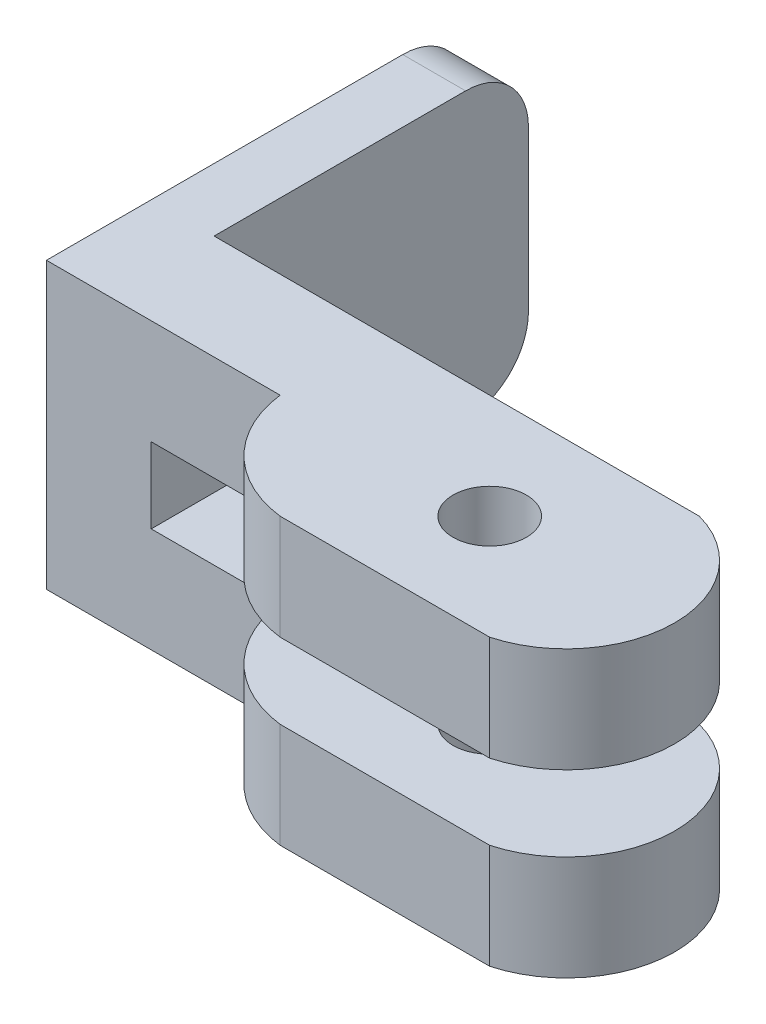
ISO-10303-21;
HEADER;
FILE_DESCRIPTION(('STEP AP214'),'2;1');
FILE_NAME('part.step','',(''),(''),'','','');
FILE_SCHEMA(('AUTOMOTIVE_DESIGN { 1 0 10303 214 1 1 1 1 }'));
ENDSEC;
DATA;
#1=APPLICATION_CONTEXT('core data for automotive mechanical design processes');
#2=APPLICATION_PROTOCOL_DEFINITION('international standard','automotive_design',2000,#1);
#3=PRODUCT_CONTEXT('',#1,'mechanical');
#4=PRODUCT('Part','Part','',(#3));
#5=PRODUCT_RELATED_PRODUCT_CATEGORY('part','',(#4));
#6=PRODUCT_DEFINITION_FORMATION('','',#4);
#7=PRODUCT_DEFINITION_CONTEXT('part definition',#1,'design');
#8=PRODUCT_DEFINITION('design','',#6,#7);
#9=PRODUCT_DEFINITION_SHAPE('','',#8);
#10=(LENGTH_UNIT() NAMED_UNIT(*) SI_UNIT(.MILLI.,.METRE.));
#11=(NAMED_UNIT(*) PLANE_ANGLE_UNIT() SI_UNIT($,.RADIAN.));
#12=(NAMED_UNIT(*) SI_UNIT($,.STERADIAN.) SOLID_ANGLE_UNIT());
#13=UNCERTAINTY_MEASURE_WITH_UNIT(LENGTH_MEASURE(1.E-05),#10,'distance_accuracy_value','');
#14=(GEOMETRIC_REPRESENTATION_CONTEXT(3) GLOBAL_UNCERTAINTY_ASSIGNED_CONTEXT((#13)) GLOBAL_UNIT_ASSIGNED_CONTEXT((#10,
#11,#12)) REPRESENTATION_CONTEXT('',''));
#15=CARTESIAN_POINT('',(0.,0.,0.));
#16=DIRECTION('',(0.,0.,1.));
#17=DIRECTION('',(1.,0.,0.));
#18=AXIS2_PLACEMENT_3D('',#15,#16,#17);
#19=CARTESIAN_POINT('',(0.,0.,0.));
#20=DIRECTION('',(0.,0.,1.));
#21=DIRECTION('',(1.,0.,0.));
#22=AXIS2_PLACEMENT_3D('',#19,#20,#21);
#23=PLANE('',#22);
#24=DIRECTION('',(0.,-1.,0.));
#25=VECTOR('',#24,1.);
#26=CARTESIAN_POINT('',(63.,0.,0.));
#27=LINE('',#26,#25);
#28=CARTESIAN_POINT('',(62.9999999999999,6.80000000000001,0.));
#29=VERTEX_POINT('',#28);
#30=CARTESIAN_POINT('',(63.,-6.79999999999999,0.));
#31=VERTEX_POINT('',#30);
#32=EDGE_CURVE('E172',#29,#31,#27,.T.);
#33=ORIENTED_EDGE('',*,*,#32,.F.);
#34=DIRECTION('',(-1.,0.,0.));
#35=VECTOR('',#34,1.);
#36=CARTESIAN_POINT('',(-90.,6.79999999999999,0.));
#37=LINE('',#36,#35);
#38=CARTESIAN_POINT('',(86.15,6.8,0.));
#39=VERTEX_POINT('',#38);
#40=EDGE_CURVE('E233',#39,#29,#37,.T.);
#41=ORIENTED_EDGE('',*,*,#40,.F.);
#42=DIRECTION('',(0.,1.,0.));
#43=VECTOR('',#42,1.);
#44=CARTESIAN_POINT('',(86.15,-6.80000000000001,0.));
#45=LINE('',#44,#43);
#46=CARTESIAN_POINT('',(86.15,1.80000000000001,0.));
#47=VERTEX_POINT('',#46);
#48=EDGE_CURVE('E198',#47,#39,#45,.T.);
#49=ORIENTED_EDGE('',*,*,#48,.F.);
#50=DIRECTION('',(1.,0.,0.));
#51=VECTOR('',#50,1.);
#52=CARTESIAN_POINT('',(90.,1.80000000000001,0.));
#53=LINE('',#52,#51);
#54=CARTESIAN_POINT('',(65.,1.80000000000001,0.));
#55=VERTEX_POINT('',#54);
#56=EDGE_CURVE('E249',#55,#47,#53,.T.);
#57=ORIENTED_EDGE('',*,*,#56,.F.);
#58=DIRECTION('',(0.,1.,0.));
#59=VECTOR('',#58,1.);
#60=CARTESIAN_POINT('',(65.,-1.79999999999999,0.));
#61=LINE('',#60,#59);
#62=CARTESIAN_POINT('',(65.,-1.79999999999999,0.));
#63=VERTEX_POINT('',#62);
#64=EDGE_CURVE('E246',#63,#55,#61,.T.);
#65=ORIENTED_EDGE('',*,*,#64,.F.);
#66=DIRECTION('',(-1.,0.,0.));
#67=VECTOR('',#66,1.);
#68=CARTESIAN_POINT('',(90.,-1.79999999999999,0.));
#69=LINE('',#68,#67);
#70=CARTESIAN_POINT('',(86.15,-1.79999999999999,0.));
#71=VERTEX_POINT('',#70);
#72=EDGE_CURVE('E244',#71,#63,#69,.T.);
#73=ORIENTED_EDGE('',*,*,#72,.F.);
#74=CARTESIAN_POINT('',(86.15,-6.80000000000001,0.));
#75=VERTEX_POINT('',#74);
#76=EDGE_CURVE('E205',#75,#71,#45,.T.);
#77=ORIENTED_EDGE('',*,*,#76,.F.);
#78=DIRECTION('',(1.,0.,0.));
#79=VECTOR('',#78,1.);
#80=CARTESIAN_POINT('',(-90.,-6.80000000000001,0.));
#81=LINE('',#80,#79);
#82=EDGE_CURVE('E228',#31,#75,#81,.T.);
#83=ORIENTED_EDGE('',*,*,#82,.F.);
#84=EDGE_LOOP('',(#33,#41,#49,#57,#65,#73,#77,#83));
#85=FACE_BOUND('',#84,.T.);
#86=ADVANCED_FACE('F37',(#85),#23,.F.);
#87=CARTESIAN_POINT('',(-90.,-6.80000000000001,10.));
#88=DIRECTION('',(0.,1.,0.));
#89=DIRECTION('',(-1.,0.,0.));
#90=AXIS2_PLACEMENT_3D('',#87,#88,#89);
#91=PLANE('',#90);
#92=DIRECTION('',(1.,0.,0.));
#93=VECTOR('',#92,1.);
#94=CARTESIAN_POINT('',(0.,-6.80000000000001,5.));
#95=LINE('',#94,#93);
#96=CARTESIAN_POINT('',(60.,-6.79999999999999,5.00000000000001));
#97=VERTEX_POINT('',#96);
#98=CARTESIAN_POINT('',(71.15,-6.80000000000001,5.));
#99=VERTEX_POINT('',#98);
#100=EDGE_CURVE('E168',#97,#99,#95,.T.);
#101=ORIENTED_EDGE('',*,*,#100,.F.);
#102=DIRECTION('',(0.,0.,1.));
#103=VECTOR('',#102,1.);
#104=CARTESIAN_POINT('',(60.,-6.79999999999999,-15.));
#105=LINE('',#104,#103);
#106=CARTESIAN_POINT('',(60.,-6.79999999999999,-12.));
#107=VERTEX_POINT('',#106);
#108=EDGE_CURVE('E152',#107,#97,#105,.T.);
#109=ORIENTED_EDGE('',*,*,#108,.F.);
#110=DIRECTION('',(-1.,0.,0.));
#111=VECTOR('',#110,1.);
#112=CARTESIAN_POINT('',(63.,-6.79999999999999,-12.));
#113=LINE('',#112,#111);
#114=CARTESIAN_POINT('',(63.,-6.79999999999999,-12.));
#115=VERTEX_POINT('',#114);
#116=EDGE_CURVE('E268',#107,#115,#113,.F.);
#117=ORIENTED_EDGE('',*,*,#116,.T.);
#118=DIRECTION('',(0.,0.,1.));
#119=VECTOR('',#118,1.);
#120=CARTESIAN_POINT('',(63.,-6.79999999999999,-15.));
#121=LINE('',#120,#119);
#122=EDGE_CURVE('E162',#115,#31,#121,.T.);
#123=ORIENTED_EDGE('',*,*,#122,.T.);
#124=ORIENTED_EDGE('',*,*,#82,.T.);
#125=CARTESIAN_POINT('',(84.7916666666666,-6.80000000000001,5.));
#126=DIRECTION('',(0.,1.,0.));
#127=DIRECTION('',(0.,0.,1.));
#128=AXIS2_PLACEMENT_3D('',#125,#126,#127);
#129=CIRCLE('',#128,5.18122277502567);
#130=CARTESIAN_POINT('',(86.15,-6.80000000000001,10.));
#131=VERTEX_POINT('',#130);
#132=EDGE_CURVE('E195',#75,#131,#129,.F.);
#133=ORIENTED_EDGE('',*,*,#132,.T.);
#134=DIRECTION('',(1.,0.,0.));
#135=VECTOR('',#134,1.);
#136=CARTESIAN_POINT('',(-90.,-6.80000000000001,10.));
#137=LINE('',#136,#135);
#138=CARTESIAN_POINT('',(76.15,-6.80000000000001,10.));
#139=VERTEX_POINT('',#138);
#140=EDGE_CURVE('E229',#139,#131,#137,.T.);
#141=ORIENTED_EDGE('',*,*,#140,.F.);
#142=CARTESIAN_POINT('',(76.8382783421429,-6.80000000000001,4.3117216578571));
#143=DIRECTION('',(0.,1.,0.));
#144=DIRECTION('',(0.,0.,1.));
#145=AXIS2_PLACEMENT_3D('',#142,#143,#144);
#146=CIRCLE('',#145,5.72976767190041);
#147=EDGE_CURVE('E178',#139,#99,#146,.F.);
#148=ORIENTED_EDGE('',*,*,#147,.T.);
#149=EDGE_LOOP('',(#101,#109,#117,#123,#124,#133,#141,#148));
#150=FACE_BOUND('',#149,.T.);
#151=CARTESIAN_POINT('',(81.1500000000001,-6.80000000000001,5.));
#152=DIRECTION('',(0.,1.,0.));
#153=DIRECTION('',(0.,0.,1.));
#154=AXIS2_PLACEMENT_3D('',#151,#152,#153);
#155=CIRCLE('',#154,1.75);
#156=CARTESIAN_POINT('',(81.1500000000001,-6.80000000000001,6.75));
#157=VERTEX_POINT('',#156);
#158=EDGE_CURVE('E201',#157,#157,#155,.F.);
#159=ORIENTED_EDGE('',*,*,#158,.F.);
#160=EDGE_LOOP('',(#159));
#161=FACE_BOUND('',#160,.T.);
#162=ADVANCED_FACE('F175',(#150,#161),#91,.F.);
#163=CARTESIAN_POINT('',(-90.,6.79999999999999,10.));
#164=DIRECTION('',(0.,-1.,0.));
#165=DIRECTION('',(1.,0.,0.));
#166=AXIS2_PLACEMENT_3D('',#163,#164,#165);
#167=PLANE('',#166);
#168=DIRECTION('',(0.,0.,1.));
#169=VECTOR('',#168,1.);
#170=CARTESIAN_POINT('',(60.,6.80000000000001,-15.));
#171=LINE('',#170,#169);
#172=CARTESIAN_POINT('',(60.,6.80000000000001,-12.));
#173=VERTEX_POINT('',#172);
#174=CARTESIAN_POINT('',(60.,6.80000000000003,5.00000000000001));
#175=VERTEX_POINT('',#174);
#176=EDGE_CURVE('E212',#173,#175,#171,.T.);
#177=ORIENTED_EDGE('',*,*,#176,.T.);
#178=DIRECTION('',(1.,0.,0.));
#179=VECTOR('',#178,1.);
#180=CARTESIAN_POINT('',(0.,6.8,5.));
#181=LINE('',#180,#179);
#182=CARTESIAN_POINT('',(71.15,6.8,5.));
#183=VERTEX_POINT('',#182);
#184=EDGE_CURVE('E171',#175,#183,#181,.T.);
#185=ORIENTED_EDGE('',*,*,#184,.T.);
#186=CARTESIAN_POINT('',(76.8382783421429,6.8,4.3117216578571));
#187=DIRECTION('',(0.,1.,0.));
#188=DIRECTION('',(0.,0.,1.));
#189=AXIS2_PLACEMENT_3D('',#186,#187,#188);
#190=CIRCLE('',#189,5.72976767190041);
#191=CARTESIAN_POINT('',(76.15,6.8,10.));
#192=VERTEX_POINT('',#191);
#193=EDGE_CURVE('E186',#192,#183,#190,.F.);
#194=ORIENTED_EDGE('',*,*,#193,.F.);
#195=DIRECTION('',(-1.,0.,0.));
#196=VECTOR('',#195,1.);
#197=CARTESIAN_POINT('',(-90.,6.79999999999999,10.));
#198=LINE('',#197,#196);
#199=CARTESIAN_POINT('',(86.15,6.8,10.));
#200=VERTEX_POINT('',#199);
#201=EDGE_CURVE('E239',#200,#192,#198,.T.);
#202=ORIENTED_EDGE('',*,*,#201,.F.);
#203=CARTESIAN_POINT('',(84.7916666666666,6.8,5.));
#204=DIRECTION('',(0.,1.,0.));
#205=DIRECTION('',(0.,0.,1.));
#206=AXIS2_PLACEMENT_3D('',#203,#204,#205);
#207=CIRCLE('',#206,5.18122277502567);
#208=EDGE_CURVE('E199',#39,#200,#207,.F.);
#209=ORIENTED_EDGE('',*,*,#208,.F.);
#210=ORIENTED_EDGE('',*,*,#40,.T.);
#211=DIRECTION('',(0.,0.,1.));
#212=VECTOR('',#211,1.);
#213=CARTESIAN_POINT('',(63.,6.80000000000001,-15.));
#214=LINE('',#213,#212);
#215=CARTESIAN_POINT('',(63.,6.80000000000001,-12.));
#216=VERTEX_POINT('',#215);
#217=EDGE_CURVE('E279',#216,#29,#214,.T.);
#218=ORIENTED_EDGE('',*,*,#217,.F.);
#219=DIRECTION('',(1.,0.,0.));
#220=VECTOR('',#219,1.);
#221=CARTESIAN_POINT('',(60.,6.80000000000001,-12.));
#222=LINE('',#221,#220);
#223=EDGE_CURVE('E266',#216,#173,#222,.F.);
#224=ORIENTED_EDGE('',*,*,#223,.T.);
#225=EDGE_LOOP('',(#177,#185,#194,#202,#209,#210,#218,#224));
#226=FACE_BOUND('',#225,.T.);
#227=CARTESIAN_POINT('',(81.1500000000001,6.8,5.));
#228=DIRECTION('',(0.,1.,0.));
#229=DIRECTION('',(0.,0.,1.));
#230=AXIS2_PLACEMENT_3D('',#227,#228,#229);
#231=CIRCLE('',#230,1.75);
#232=CARTESIAN_POINT('',(81.1500000000001,6.8,6.75));
#233=VERTEX_POINT('',#232);
#234=EDGE_CURVE('E209',#233,#233,#231,.F.);
#235=ORIENTED_EDGE('',*,*,#234,.T.);
#236=EDGE_LOOP('',(#235));
#237=FACE_BOUND('',#236,.T.);
#238=ADVANCED_FACE('F282',(#226,#237),#167,.F.);
#239=CARTESIAN_POINT('',(0.,0.,10.));
#240=DIRECTION('',(0.,0.,1.));
#241=DIRECTION('',(1.,0.,0.));
#242=AXIS2_PLACEMENT_3D('',#239,#240,#241);
#243=PLANE('',#242);
#244=DIRECTION('',(0.,1.,0.));
#245=VECTOR('',#244,1.);
#246=CARTESIAN_POINT('',(76.15,-6.80000000000001,10.));
#247=LINE('',#246,#245);
#248=CARTESIAN_POINT('',(76.15,-1.79999999999999,10.));
#249=VERTEX_POINT('',#248);
#250=EDGE_CURVE('E181',#139,#249,#247,.T.);
#251=ORIENTED_EDGE('',*,*,#250,.F.);
#252=ORIENTED_EDGE('',*,*,#140,.T.);
#253=DIRECTION('',(0.,1.,0.));
#254=VECTOR('',#253,1.);
#255=CARTESIAN_POINT('',(86.15,-6.80000000000001,10.));
#256=LINE('',#255,#254);
#257=CARTESIAN_POINT('',(86.15,-1.79999999999999,10.));
#258=VERTEX_POINT('',#257);
#259=EDGE_CURVE('E189',#131,#258,#256,.T.);
#260=ORIENTED_EDGE('',*,*,#259,.T.);
#261=DIRECTION('',(-1.,0.,0.));
#262=VECTOR('',#261,1.);
#263=CARTESIAN_POINT('',(90.,-1.79999999999999,10.));
#264=LINE('',#263,#262);
#265=EDGE_CURVE('E232',#258,#249,#264,.T.);
#266=ORIENTED_EDGE('',*,*,#265,.T.);
#267=EDGE_LOOP('',(#251,#252,#260,#266));
#268=FACE_BOUND('',#267,.T.);
#269=ADVANCED_FACE('F336',(#268),#243,.T.);
#270=CARTESIAN_POINT('',(90.,-1.79999999999999,10.));
#271=DIRECTION('',(0.,-1.,0.));
#272=DIRECTION('',(1.,0.,0.));
#273=AXIS2_PLACEMENT_3D('',#270,#271,#272);
#274=PLANE('',#273);
#275=DIRECTION('',(-1.,0.,0.));
#276=VECTOR('',#275,1.);
#277=CARTESIAN_POINT('',(90.,-1.79999999999999,5.));
#278=LINE('',#277,#276);
#279=CARTESIAN_POINT('',(71.15,-1.79999999999999,5.));
#280=VERTEX_POINT('',#279);
#281=CARTESIAN_POINT('',(65.,-1.79999999999999,5.));
#282=VERTEX_POINT('',#281);
#283=EDGE_CURVE('E216',#280,#282,#278,.T.);
#284=ORIENTED_EDGE('',*,*,#283,.F.);
#285=CARTESIAN_POINT('',(76.8382783421429,-1.79999999999999,4.3117216578571));
#286=DIRECTION('',(0.,-1.,0.));
#287=DIRECTION('',(1.,0.,0.));
#288=AXIS2_PLACEMENT_3D('',#285,#286,#287);
#289=CIRCLE('',#288,5.72976767190041);
#290=EDGE_CURVE('E225',#280,#249,#289,.F.);
#291=ORIENTED_EDGE('',*,*,#290,.T.);
#292=ORIENTED_EDGE('',*,*,#265,.F.);
#293=CARTESIAN_POINT('',(84.7916666666666,-1.79999999999999,5.));
#294=DIRECTION('',(0.,-1.,0.));
#295=DIRECTION('',(1.,0.,0.));
#296=AXIS2_PLACEMENT_3D('',#293,#294,#295);
#297=CIRCLE('',#296,5.18122277502567);
#298=EDGE_CURVE('E222',#258,#71,#297,.F.);
#299=ORIENTED_EDGE('',*,*,#298,.T.);
#300=ORIENTED_EDGE('',*,*,#72,.T.);
#301=DIRECTION('',(0.,0.,-1.));
#302=VECTOR('',#301,1.);
#303=CARTESIAN_POINT('',(65.,-1.79999999999999,10.));
#304=LINE('',#303,#302);
#305=EDGE_CURVE('E255',#282,#63,#304,.T.);
#306=ORIENTED_EDGE('',*,*,#305,.F.);
#307=EDGE_LOOP('',(#284,#291,#292,#299,#300,#306));
#308=FACE_BOUND('',#307,.T.);
#309=CARTESIAN_POINT('',(81.1500000000001,-1.79999999999999,5.));
#310=DIRECTION('',(0.,-1.,0.));
#311=DIRECTION('',(1.,0.,0.));
#312=AXIS2_PLACEMENT_3D('',#309,#310,#311);
#313=CIRCLE('',#312,1.75);
#314=CARTESIAN_POINT('',(82.9000000000001,-1.79999999999999,5.));
#315=VERTEX_POINT('',#314);
#316=EDGE_CURVE('E219',#315,#315,#313,.F.);
#317=ORIENTED_EDGE('',*,*,#316,.F.);
#318=EDGE_LOOP('',(#317));
#319=FACE_BOUND('',#318,.T.);
#320=ADVANCED_FACE('F342',(#308,#319),#274,.F.);
#321=CARTESIAN_POINT('',(65.,-1.79999999999999,10.));
#322=DIRECTION('',(-1.,0.,0.));
#323=DIRECTION('',(0.,0.,1.));
#324=AXIS2_PLACEMENT_3D('',#321,#322,#323);
#325=PLANE('',#324);
#326=DIRECTION('',(0.,1.,0.));
#327=VECTOR('',#326,1.);
#328=CARTESIAN_POINT('',(65.,-1.79999999999999,5.));
#329=LINE('',#328,#327);
#330=CARTESIAN_POINT('',(65.,1.80000000000001,5.));
#331=VERTEX_POINT('',#330);
#332=EDGE_CURVE('E214',#282,#331,#329,.T.);
#333=ORIENTED_EDGE('',*,*,#332,.F.);
#334=ORIENTED_EDGE('',*,*,#305,.T.);
#335=ORIENTED_EDGE('',*,*,#64,.T.);
#336=DIRECTION('',(0.,0.,-1.));
#337=VECTOR('',#336,1.);
#338=CARTESIAN_POINT('',(65.,1.80000000000001,10.));
#339=LINE('',#338,#337);
#340=EDGE_CURVE('E242',#331,#55,#339,.T.);
#341=ORIENTED_EDGE('',*,*,#340,.F.);
#342=EDGE_LOOP('',(#333,#334,#335,#341));
#343=FACE_BOUND('',#342,.T.);
#344=ADVANCED_FACE('F339',(#343),#325,.F.);
#345=CARTESIAN_POINT('',(90.,1.80000000000001,10.));
#346=DIRECTION('',(0.,1.,0.));
#347=DIRECTION('',(-1.,0.,0.));
#348=AXIS2_PLACEMENT_3D('',#345,#346,#347);
#349=PLANE('',#348);
#350=DIRECTION('',(1.,0.,0.));
#351=VECTOR('',#350,1.);
#352=CARTESIAN_POINT('',(90.,1.80000000000001,5.));
#353=LINE('',#352,#351);
#354=CARTESIAN_POINT('',(71.15,1.80000000000001,5.));
#355=VERTEX_POINT('',#354);
#356=EDGE_CURVE('E192',#331,#355,#353,.T.);
#357=ORIENTED_EDGE('',*,*,#356,.F.);
#358=ORIENTED_EDGE('',*,*,#340,.T.);
#359=ORIENTED_EDGE('',*,*,#56,.T.);
#360=CARTESIAN_POINT('',(84.7916666666666,1.80000000000001,5.));
#361=DIRECTION('',(0.,1.,0.));
#362=DIRECTION('',(-1.,0.,0.));
#363=AXIS2_PLACEMENT_3D('',#360,#361,#362);
#364=CIRCLE('',#363,5.18122277502567);
#365=CARTESIAN_POINT('',(86.15,1.80000000000001,10.));
#366=VERTEX_POINT('',#365);
#367=EDGE_CURVE('E258',#47,#366,#364,.F.);
#368=ORIENTED_EDGE('',*,*,#367,.T.);
#369=DIRECTION('',(1.,0.,0.));
#370=VECTOR('',#369,1.);
#371=CARTESIAN_POINT('',(90.,1.80000000000001,10.));
#372=LINE('',#371,#370);
#373=CARTESIAN_POINT('',(76.15,1.80000000000001,10.));
#374=VERTEX_POINT('',#373);
#375=EDGE_CURVE('E236',#374,#366,#372,.T.);
#376=ORIENTED_EDGE('',*,*,#375,.F.);
#377=CARTESIAN_POINT('',(76.8382783421429,1.80000000000001,4.3117216578571));
#378=DIRECTION('',(0.,1.,0.));
#379=DIRECTION('',(-1.,0.,0.));
#380=AXIS2_PLACEMENT_3D('',#377,#378,#379);
#381=CIRCLE('',#380,5.72976767190041);
#382=EDGE_CURVE('E263',#374,#355,#381,.F.);
#383=ORIENTED_EDGE('',*,*,#382,.T.);
#384=EDGE_LOOP('',(#357,#358,#359,#368,#376,#383));
#385=FACE_BOUND('',#384,.T.);
#386=CARTESIAN_POINT('',(81.1500000000001,1.80000000000001,5.));
#387=DIRECTION('',(0.,1.,0.));
#388=DIRECTION('',(-1.,0.,0.));
#389=AXIS2_PLACEMENT_3D('',#386,#387,#388);
#390=CIRCLE('',#389,1.75);
#391=CARTESIAN_POINT('',(79.4,1.80000000000001,5.));
#392=VERTEX_POINT('',#391);
#393=EDGE_CURVE('E218',#392,#392,#390,.F.);
#394=ORIENTED_EDGE('',*,*,#393,.F.);
#395=EDGE_LOOP('',(#394));
#396=FACE_BOUND('',#395,.T.);
#397=ADVANCED_FACE('F310',(#385,#396),#349,.F.);
#398=EDGE_CURVE('E179',#374,#192,#247,.T.);
#399=ORIENTED_EDGE('',*,*,#398,.F.);
#400=ORIENTED_EDGE('',*,*,#375,.T.);
#401=EDGE_CURVE('E204',#366,#200,#256,.T.);
#402=ORIENTED_EDGE('',*,*,#401,.T.);
#403=ORIENTED_EDGE('',*,*,#201,.T.);
#404=EDGE_LOOP('',(#399,#400,#402,#403));
#405=FACE_BOUND('',#404,.T.);
#406=ADVANCED_FACE('F307',(#405),#243,.T.);
#407=CARTESIAN_POINT('',(76.8382783421429,-6.80000000000001,4.3117216578571));
#408=DIRECTION('',(0.,1.,0.));
#409=DIRECTION('',(0.,0.,1.));
#410=AXIS2_PLACEMENT_3D('',#407,#408,#409);
#411=CYLINDRICAL_SURFACE('',#410,5.72976767190041);
#412=DIRECTION('',(0.,1.,0.));
#413=VECTOR('',#412,1.);
#414=CARTESIAN_POINT('',(71.15,-6.80000000000001,5.));
#415=LINE('',#414,#413);
#416=EDGE_CURVE('E191',#99,#280,#415,.T.);
#417=ORIENTED_EDGE('',*,*,#416,.F.);
#418=ORIENTED_EDGE('',*,*,#147,.F.);
#419=ORIENTED_EDGE('',*,*,#250,.T.);
#420=ORIENTED_EDGE('',*,*,#290,.F.);
#421=EDGE_LOOP('',(#417,#418,#419,#420));
#422=FACE_BOUND('',#421,.T.);
#423=ADVANCED_FACE('F378',(#422),#411,.T.);
#424=ORIENTED_EDGE('',*,*,#398,.T.);
#425=ORIENTED_EDGE('',*,*,#193,.T.);
#426=EDGE_CURVE('E193',#355,#183,#415,.T.);
#427=ORIENTED_EDGE('',*,*,#426,.F.);
#428=ORIENTED_EDGE('',*,*,#382,.F.);
#429=EDGE_LOOP('',(#424,#425,#427,#428));
#430=FACE_BOUND('',#429,.T.);
#431=ADVANCED_FACE('F303',(#430),#411,.T.);
#432=CARTESIAN_POINT('',(0.,-6.80000000000001,5.));
#433=DIRECTION('',(0.,0.,1.));
#434=DIRECTION('',(1.,0.,0.));
#435=AXIS2_PLACEMENT_3D('',#432,#433,#434);
#436=PLANE('',#435);
#437=DIRECTION('',(0.,1.,0.));
#438=VECTOR('',#437,1.);
#439=CARTESIAN_POINT('',(60.,-6.80000000000001,5.));
#440=LINE('',#439,#438);
#441=EDGE_CURVE('E156',#97,#175,#440,.T.);
#442=ORIENTED_EDGE('',*,*,#441,.F.);
#443=ORIENTED_EDGE('',*,*,#100,.T.);
#444=ORIENTED_EDGE('',*,*,#416,.T.);
#445=ORIENTED_EDGE('',*,*,#283,.T.);
#446=ORIENTED_EDGE('',*,*,#332,.T.);
#447=ORIENTED_EDGE('',*,*,#356,.T.);
#448=ORIENTED_EDGE('',*,*,#426,.T.);
#449=ORIENTED_EDGE('',*,*,#184,.F.);
#450=EDGE_LOOP('',(#442,#443,#444,#445,#446,#447,#448,#449));
#451=FACE_BOUND('',#450,.T.);
#452=ADVANCED_FACE('F166',(#451),#436,.T.);
#453=CARTESIAN_POINT('',(81.1500000000001,-6.80000000000001,5.));
#454=DIRECTION('',(0.,1.,0.));
#455=DIRECTION('',(0.,0.,1.));
#456=AXIS2_PLACEMENT_3D('',#453,#454,#455);
#457=CYLINDRICAL_SURFACE('',#456,1.75);
#458=ORIENTED_EDGE('',*,*,#234,.F.);
#459=EDGE_LOOP('',(#458));
#460=FACE_BOUND('',#459,.T.);
#461=ORIENTED_EDGE('',*,*,#393,.T.);
#462=EDGE_LOOP('',(#461));
#463=FACE_BOUND('',#462,.T.);
#464=ADVANCED_FACE('F359',(#460,#463),#457,.F.);
#465=CARTESIAN_POINT('',(84.7916666666666,-6.80000000000001,5.));
#466=DIRECTION('',(0.,1.,0.));
#467=DIRECTION('',(0.,0.,1.));
#468=AXIS2_PLACEMENT_3D('',#465,#466,#467);
#469=CYLINDRICAL_SURFACE('',#468,5.18122277502567);
#470=ORIENTED_EDGE('',*,*,#48,.T.);
#471=ORIENTED_EDGE('',*,*,#208,.T.);
#472=ORIENTED_EDGE('',*,*,#401,.F.);
#473=ORIENTED_EDGE('',*,*,#367,.F.);
#474=EDGE_LOOP('',(#470,#471,#472,#473));
#475=FACE_BOUND('',#474,.T.);
#476=ADVANCED_FACE('F315',(#475),#469,.T.);
#477=ORIENTED_EDGE('',*,*,#158,.T.);
#478=EDGE_LOOP('',(#477));
#479=FACE_BOUND('',#478,.T.);
#480=ORIENTED_EDGE('',*,*,#316,.T.);
#481=EDGE_LOOP('',(#480));
#482=FACE_BOUND('',#481,.T.);
#483=ADVANCED_FACE('F355',(#479,#482),#457,.F.);
#484=ORIENTED_EDGE('',*,*,#259,.F.);
#485=ORIENTED_EDGE('',*,*,#132,.F.);
#486=ORIENTED_EDGE('',*,*,#76,.T.);
#487=ORIENTED_EDGE('',*,*,#298,.F.);
#488=EDGE_LOOP('',(#484,#485,#486,#487));
#489=FACE_BOUND('',#488,.T.);
#490=ADVANCED_FACE('F357',(#489),#469,.T.);
#491=CARTESIAN_POINT('',(60.,0.,-15.));
#492=DIRECTION('',(-1.,0.,0.));
#493=DIRECTION('',(0.,-1.,0.));
#494=AXIS2_PLACEMENT_3D('',#491,#492,#493);
#495=PLANE('',#494);
#496=ORIENTED_EDGE('',*,*,#176,.F.);
#497=CARTESIAN_POINT('',(60.,3.80000000000001,-12.));
#498=DIRECTION('',(-1.,0.,0.));
#499=DIRECTION('',(0.,-1.,0.));
#500=AXIS2_PLACEMENT_3D('',#497,#498,#499);
#501=CIRCLE('',#500,3.);
#502=CARTESIAN_POINT('',(60.,3.80000000000001,-15.));
#503=VERTEX_POINT('',#502);
#504=EDGE_CURVE('E11',#173,#503,#501,.T.);
#505=ORIENTED_EDGE('',*,*,#504,.T.);
#506=DIRECTION('',(0.,-1.,0.));
#507=VECTOR('',#506,1.);
#508=CARTESIAN_POINT('',(60.,0.,-15.));
#509=LINE('',#508,#507);
#510=CARTESIAN_POINT('',(60.,-3.79999999999999,-15.));
#511=VERTEX_POINT('',#510);
#512=EDGE_CURVE('E290',#503,#511,#509,.T.);
#513=ORIENTED_EDGE('',*,*,#512,.T.);
#514=CARTESIAN_POINT('',(60.,-3.79999999999999,-12.));
#515=DIRECTION('',(-1.,0.,0.));
#516=DIRECTION('',(0.,-1.,0.));
#517=AXIS2_PLACEMENT_3D('',#514,#515,#516);
#518=CIRCLE('',#517,3.);
#519=EDGE_CURVE('E45',#511,#107,#518,.T.);
#520=ORIENTED_EDGE('',*,*,#519,.T.);
#521=ORIENTED_EDGE('',*,*,#108,.T.);
#522=ORIENTED_EDGE('',*,*,#441,.T.);
#523=EDGE_LOOP('',(#496,#505,#513,#520,#521,#522));
#524=FACE_BOUND('',#523,.T.);
#525=ADVANCED_FACE('F155',(#524),#495,.T.);
#526=CARTESIAN_POINT('',(63.,0.,-15.));
#527=DIRECTION('',(-1.,0.,0.));
#528=DIRECTION('',(0.,0.,1.));
#529=AXIS2_PLACEMENT_3D('',#526,#527,#528);
#530=PLANE('',#529);
#531=DIRECTION('',(0.,-1.,0.));
#532=VECTOR('',#531,1.);
#533=CARTESIAN_POINT('',(63.,0.,-15.));
#534=LINE('',#533,#532);
#535=CARTESIAN_POINT('',(63.,3.80000000000001,-15.));
#536=VERTEX_POINT('',#535);
#537=CARTESIAN_POINT('',(63.,-3.79999999999999,-15.));
#538=VERTEX_POINT('',#537);
#539=EDGE_CURVE('E163',#536,#538,#534,.T.);
#540=ORIENTED_EDGE('',*,*,#539,.F.);
#541=CARTESIAN_POINT('',(63.,3.80000000000001,-12.));
#542=DIRECTION('',(-1.,0.,0.));
#543=DIRECTION('',(0.,0.,1.));
#544=AXIS2_PLACEMENT_3D('',#541,#542,#543);
#545=CIRCLE('',#544,3.);
#546=EDGE_CURVE('E60',#536,#216,#545,.F.);
#547=ORIENTED_EDGE('',*,*,#546,.T.);
#548=ORIENTED_EDGE('',*,*,#217,.T.);
#549=ORIENTED_EDGE('',*,*,#32,.T.);
#550=ORIENTED_EDGE('',*,*,#122,.F.);
#551=CARTESIAN_POINT('',(63.,-3.79999999999999,-12.));
#552=DIRECTION('',(-1.,0.,0.));
#553=DIRECTION('',(0.,0.,1.));
#554=AXIS2_PLACEMENT_3D('',#551,#552,#553);
#555=CIRCLE('',#554,3.);
#556=EDGE_CURVE('E52',#115,#538,#555,.F.);
#557=ORIENTED_EDGE('',*,*,#556,.T.);
#558=EDGE_LOOP('',(#540,#547,#548,#549,#550,#557));
#559=FACE_BOUND('',#558,.T.);
#560=ADVANCED_FACE('F277',(#559),#530,.F.);
#561=CARTESIAN_POINT('',(0.,0.,-15.));
#562=DIRECTION('',(0.,0.,-1.));
#563=DIRECTION('',(-1.,0.,0.));
#564=AXIS2_PLACEMENT_3D('',#561,#562,#563);
#565=PLANE('',#564);
#566=ORIENTED_EDGE('',*,*,#512,.F.);
#567=DIRECTION('',(1.,0.,0.));
#568=VECTOR('',#567,1.);
#569=CARTESIAN_POINT('',(63.,3.80000000000001,-15.));
#570=LINE('',#569,#568);
#571=EDGE_CURVE('E273',#503,#536,#570,.T.);
#572=ORIENTED_EDGE('',*,*,#571,.T.);
#573=ORIENTED_EDGE('',*,*,#539,.T.);
#574=DIRECTION('',(-1.,0.,0.));
#575=VECTOR('',#574,1.);
#576=CARTESIAN_POINT('',(60.,-3.79999999999999,-15.));
#577=LINE('',#576,#575);
#578=EDGE_CURVE('E270',#538,#511,#577,.T.);
#579=ORIENTED_EDGE('',*,*,#578,.T.);
#580=EDGE_LOOP('',(#566,#572,#573,#579));
#581=FACE_BOUND('',#580,.T.);
#582=ADVANCED_FACE('F292',(#581),#565,.T.);
#583=CARTESIAN_POINT('',(0.,3.8,-12.));
#584=DIRECTION('',(-1.,0.,0.));
#585=DIRECTION('',(0.,-1.,0.));
#586=AXIS2_PLACEMENT_3D('',#583,#584,#585);
#587=CYLINDRICAL_SURFACE('',#586,3.);
#588=ORIENTED_EDGE('',*,*,#504,.F.);
#589=ORIENTED_EDGE('',*,*,#223,.F.);
#590=ORIENTED_EDGE('',*,*,#546,.F.);
#591=ORIENTED_EDGE('',*,*,#571,.F.);
#592=EDGE_LOOP('',(#588,#589,#590,#591));
#593=FACE_BOUND('',#592,.T.);
#594=ADVANCED_FACE('F288',(#593),#587,.T.);
#595=CARTESIAN_POINT('',(0.,-3.8,-12.));
#596=DIRECTION('',(1.,0.,0.));
#597=DIRECTION('',(0.,1.,0.));
#598=AXIS2_PLACEMENT_3D('',#595,#596,#597);
#599=CYLINDRICAL_SURFACE('',#598,3.);
#600=ORIENTED_EDGE('',*,*,#556,.F.);
#601=ORIENTED_EDGE('',*,*,#116,.F.);
#602=ORIENTED_EDGE('',*,*,#519,.F.);
#603=ORIENTED_EDGE('',*,*,#578,.F.);
#604=EDGE_LOOP('',(#600,#601,#602,#603));
#605=FACE_BOUND('',#604,.T.);
#606=ADVANCED_FACE('F39',(#605),#599,.T.);
#607=CLOSED_SHELL('',(#86,#162,#238,#269,#320,#344,#397,#406,#423,#431,#452,#464,#476,#483,#490,
#525,#560,#582,#594,#606));
#608=MANIFOLD_SOLID_BREP('B2',#607);
#609=ADVANCED_BREP_SHAPE_REPRESENTATION('',(#18,#608),#14);
#610=SHAPE_DEFINITION_REPRESENTATION(#9,#609);
ENDSEC;
END-ISO-10303-21;
